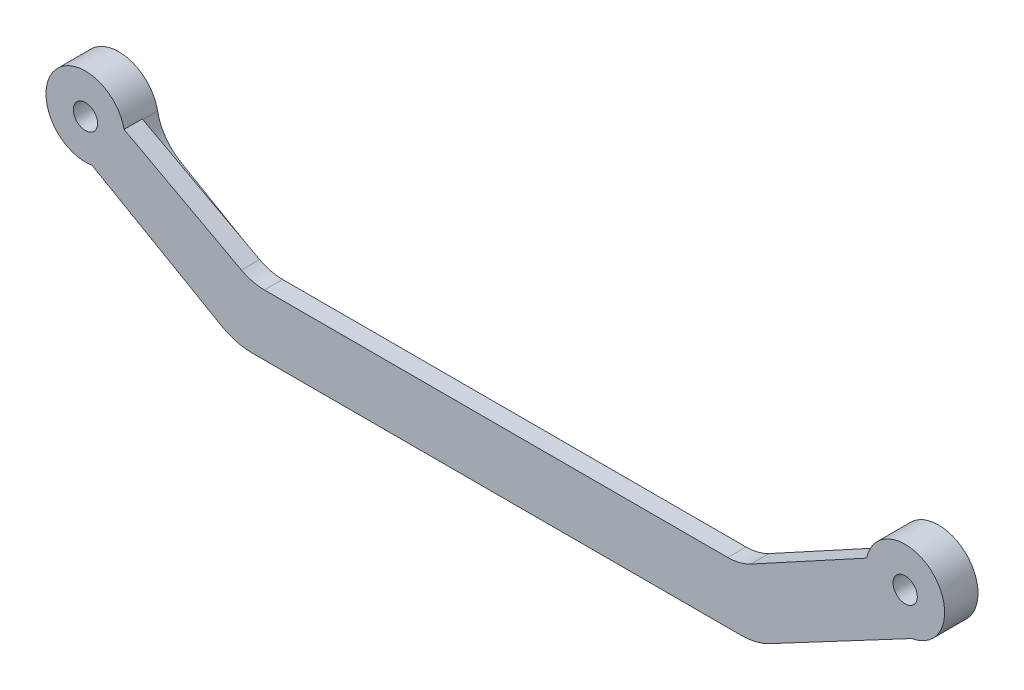
ISO-10303-21;
HEADER;
FILE_DESCRIPTION(('STEP AP214'),'2;1');
FILE_NAME('part.step','',(''),(''),'','','');
FILE_SCHEMA(('AUTOMOTIVE_DESIGN { 1 0 10303 214 1 1 1 1 }'));
ENDSEC;
DATA;
#1=APPLICATION_CONTEXT('core data for automotive mechanical design processes');
#2=APPLICATION_PROTOCOL_DEFINITION('international standard','automotive_design',2000,#1);
#3=PRODUCT_CONTEXT('',#1,'mechanical');
#4=PRODUCT('Part','Part','',(#3));
#5=PRODUCT_RELATED_PRODUCT_CATEGORY('part','',(#4));
#6=PRODUCT_DEFINITION_FORMATION('','',#4);
#7=PRODUCT_DEFINITION_CONTEXT('part definition',#1,'design');
#8=PRODUCT_DEFINITION('design','',#6,#7);
#9=PRODUCT_DEFINITION_SHAPE('','',#8);
#10=(LENGTH_UNIT() NAMED_UNIT(*) SI_UNIT(.MILLI.,.METRE.));
#11=(NAMED_UNIT(*) PLANE_ANGLE_UNIT() SI_UNIT($,.RADIAN.));
#12=(NAMED_UNIT(*) SI_UNIT($,.STERADIAN.) SOLID_ANGLE_UNIT());
#13=UNCERTAINTY_MEASURE_WITH_UNIT(LENGTH_MEASURE(1.E-05),#10,'distance_accuracy_value','');
#14=(GEOMETRIC_REPRESENTATION_CONTEXT(3) GLOBAL_UNCERTAINTY_ASSIGNED_CONTEXT((#13)) GLOBAL_UNIT_ASSIGNED_CONTEXT((#10,
#11,#12)) REPRESENTATION_CONTEXT('',''));
#15=CARTESIAN_POINT('',(0.,0.,0.));
#16=DIRECTION('',(0.,0.,1.));
#17=DIRECTION('',(1.,0.,0.));
#18=AXIS2_PLACEMENT_3D('',#15,#16,#17);
#19=CARTESIAN_POINT('',(-41.12,-13.8583741431154,8.));
#20=DIRECTION('',(-0.500348796428705,-0.865823932397544,0.));
#21=DIRECTION('',(0.865823932397544,-0.500348796428705,0.));
#22=AXIS2_PLACEMENT_3D('',#19,#20,#21);
#23=PLANE('',#22);
#24=DIRECTION('',(-0.865823932397544,0.500348796428705,0.));
#25=VECTOR('',#24,1.);
#26=CARTESIAN_POINT('',(-41.12,-13.8583741431154,8.));
#27=LINE('',#26,#25);
#28=CARTESIAN_POINT('',(-42.9774698500629,-12.7849656022957,8.));
#29=VERTEX_POINT('',#28);
#30=CARTESIAN_POINT('',(-57.2678634588736,-4.5267262823668,8.));
#31=VERTEX_POINT('',#30);
#32=EDGE_CURVE('E255',#29,#31,#27,.T.);
#33=ORIENTED_EDGE('',*,*,#32,.F.);
#34=DIRECTION('',(0.,0.,-1.));
#35=VECTOR('',#34,1.);
#36=CARTESIAN_POINT('',(-42.9774698500629,-12.7849656022958,5.5));
#37=LINE('',#36,#35);
#38=CARTESIAN_POINT('',(-42.9774698500629,-12.7849656022957,5.5));
#39=VERTEX_POINT('',#38);
#40=EDGE_CURVE('E397',#29,#39,#37,.T.);
#41=ORIENTED_EDGE('',*,*,#40,.T.);
#42=DIRECTION('',(-0.865823932397544,0.500348796428705,0.));
#43=VECTOR('',#42,1.);
#44=CARTESIAN_POINT('',(-41.12,-13.8583741431154,5.5));
#45=LINE('',#44,#43);
#46=CARTESIAN_POINT('',(-57.2678634588736,-4.5267262823668,5.5));
#47=VERTEX_POINT('',#46);
#48=EDGE_CURVE('E245',#39,#47,#45,.T.);
#49=ORIENTED_EDGE('',*,*,#48,.T.);
#50=DIRECTION('',(0.,0.,1.));
#51=VECTOR('',#50,1.);
#52=CARTESIAN_POINT('',(-57.2678634588736,-4.5267262823668,8.));
#53=LINE('',#52,#51);
#54=EDGE_CURVE('E346',#47,#31,#53,.T.);
#55=ORIENTED_EDGE('',*,*,#54,.T.);
#56=EDGE_LOOP('',(#33,#41,#49,#55));
#57=FACE_BOUND('',#56,.T.);
#58=ADVANCED_FACE('F35',(#57),#23,.F.);
#59=CARTESIAN_POINT('',(-67.5,-0.359999999999997,8.));
#60=DIRECTION('',(0.,0.,-1.));
#61=DIRECTION('',(-1.,0.,0.));
#62=AXIS2_PLACEMENT_3D('',#59,#60,#61);
#63=CYLINDRICAL_SURFACE('',#62,6.5);
#64=CARTESIAN_POINT('',(-67.5,-0.359999999999997,8.));
#65=DIRECTION('',(0.,0.,1.));
#66=DIRECTION('',(1.,0.,0.));
#67=AXIS2_PLACEMENT_3D('',#64,#65,#66);
#68=CIRCLE('',#67,6.5);
#69=CARTESIAN_POINT('',(-61.1188258667852,0.877180941330215,8.));
#70=VERTEX_POINT('',#69);
#71=CARTESIAN_POINT('',(-61.14,0.981789849417545,8.));
#72=VERTEX_POINT('',#71);
#73=EDGE_CURVE('E258',#70,#72,#68,.T.);
#74=ORIENTED_EDGE('',*,*,#73,.F.);
#75=DIRECTION('',(0.,0.,-1.));
#76=VECTOR('',#75,1.);
#77=CARTESIAN_POINT('',(-61.1188258667852,0.877180941330215,8.));
#78=LINE('',#77,#76);
#79=CARTESIAN_POINT('',(-61.1188258667852,0.877180941330215,5.5));
#80=VERTEX_POINT('',#79);
#81=EDGE_CURVE('E343',#70,#80,#78,.T.);
#82=ORIENTED_EDGE('',*,*,#81,.T.);
#83=CARTESIAN_POINT('',(-67.5,-0.359999999999997,5.5));
#84=DIRECTION('',(0.,0.,1.));
#85=DIRECTION('',(1.,0.,0.));
#86=AXIS2_PLACEMENT_3D('',#83,#84,#85);
#87=CIRCLE('',#86,6.5);
#88=CARTESIAN_POINT('',(-65.3745958226368,-6.50269135500448,5.5));
#89=VERTEX_POINT('',#88);
#90=EDGE_CURVE('E248',#80,#89,#87,.T.);
#91=ORIENTED_EDGE('',*,*,#90,.T.);
#92=DIRECTION('',(0.,0.,-1.));
#93=VECTOR('',#92,1.);
#94=CARTESIAN_POINT('',(-65.3745958226368,-6.50269135500448,8.));
#95=LINE('',#94,#93);
#96=CARTESIAN_POINT('',(-65.3745958226368,-6.50269135500448,8.));
#97=VERTEX_POINT('',#96);
#98=EDGE_CURVE('E341',#89,#97,#95,.F.);
#99=ORIENTED_EDGE('',*,*,#98,.T.);
#100=CARTESIAN_POINT('',(-66.4124611078909,-6.7683741431154,8.));
#101=VERTEX_POINT('',#100);
#102=EDGE_CURVE('E243',#101,#97,#68,.T.);
#103=ORIENTED_EDGE('',*,*,#102,.F.);
#104=DIRECTION('',(0.,0.,-1.));
#105=VECTOR('',#104,1.);
#106=CARTESIAN_POINT('',(-66.4124611078909,-6.7683741431154,11.));
#107=LINE('',#106,#105);
#108=CARTESIAN_POINT('',(-66.4124611078909,-6.7683741431154,11.));
#109=VERTEX_POINT('',#108);
#110=EDGE_CURVE('E225',#109,#101,#107,.T.);
#111=ORIENTED_EDGE('',*,*,#110,.F.);
#112=CARTESIAN_POINT('',(-67.5,-0.359999999999997,11.));
#113=DIRECTION('',(0.,0.,1.));
#114=DIRECTION('',(1.,0.,0.));
#115=AXIS2_PLACEMENT_3D('',#112,#113,#114);
#116=CIRCLE('',#115,6.5);
#117=CARTESIAN_POINT('',(-61.14,0.981789849417544,11.));
#118=VERTEX_POINT('',#117);
#119=EDGE_CURVE('E230',#118,#109,#116,.T.);
#120=ORIENTED_EDGE('',*,*,#119,.F.);
#121=DIRECTION('',(0.,0.,-1.));
#122=VECTOR('',#121,1.);
#123=CARTESIAN_POINT('',(-61.14,0.981789849417544,11.));
#124=LINE('',#123,#122);
#125=EDGE_CURVE('E425',#118,#72,#124,.T.);
#126=ORIENTED_EDGE('',*,*,#125,.T.);
#127=EDGE_LOOP('',(#74,#82,#91,#99,#103,#111,#120,#126));
#128=FACE_BOUND('',#127,.T.);
#129=ADVANCED_FACE('F241',(#128),#63,.T.);
#130=CARTESIAN_POINT('',(-41.92,-16.8583741431154,8.));
#131=DIRECTION('',(0.500069990121084,0.865984991198057,0.));
#132=DIRECTION('',(-0.865984991198057,0.500069990121084,0.));
#133=AXIS2_PLACEMENT_3D('',#130,#131,#132);
#134=PLANE('',#133);
#135=DIRECTION('',(0.865984991198057,-0.500069990121084,0.));
#136=VECTOR('',#135,1.);
#137=CARTESIAN_POINT('',(-41.92,-16.8583741431154,8.));
#138=LINE('',#137,#136);
#139=CARTESIAN_POINT('',(-58.758153837221,-7.13504693927171,8.));
#140=VERTEX_POINT('',#139);
#141=CARTESIAN_POINT('',(-44.240774861728,-15.518224055096,8.));
#142=VERTEX_POINT('',#141);
#143=EDGE_CURVE('E261',#140,#142,#138,.T.);
#144=ORIENTED_EDGE('',*,*,#143,.F.);
#145=DIRECTION('',(0.,0.,1.));
#146=VECTOR('',#145,1.);
#147=CARTESIAN_POINT('',(-58.758153837221,-7.13504693927171,5.5));
#148=LINE('',#147,#146);
#149=CARTESIAN_POINT('',(-58.758153837221,-7.13504693927171,5.5));
#150=VERTEX_POINT('',#149);
#151=EDGE_CURVE('E353',#140,#150,#148,.F.);
#152=ORIENTED_EDGE('',*,*,#151,.T.);
#153=DIRECTION('',(0.865984991198057,-0.500069990121084,0.));
#154=VECTOR('',#153,1.);
#155=CARTESIAN_POINT('',(-41.92,-16.8583741431154,5.5));
#156=LINE('',#155,#154);
#157=CARTESIAN_POINT('',(-44.240774861728,-15.518224055096,5.5));
#158=VERTEX_POINT('',#157);
#159=EDGE_CURVE('E281',#150,#158,#156,.T.);
#160=ORIENTED_EDGE('',*,*,#159,.T.);
#161=DIRECTION('',(0.,0.,-1.));
#162=VECTOR('',#161,1.);
#163=CARTESIAN_POINT('',(-44.240774861728,-15.518224055096,8.));
#164=LINE('',#163,#162);
#165=EDGE_CURVE('E328',#158,#142,#164,.F.);
#166=ORIENTED_EDGE('',*,*,#165,.T.);
#167=EDGE_LOOP('',(#144,#152,#160,#166));
#168=FACE_BOUND('',#167,.T.);
#169=ADVANCED_FACE('F494',(#168),#134,.F.);
#170=CARTESIAN_POINT('',(-41.92,-16.8583741431154,8.));
#171=DIRECTION('',(0.,1.,0.));
#172=DIRECTION('',(0.,0.,1.));
#173=AXIS2_PLACEMENT_3D('',#170,#171,#172);
#174=PLANE('',#173);
#175=DIRECTION('',(1.,0.,0.));
#176=VECTOR('',#175,1.);
#177=CARTESIAN_POINT('',(-41.92,-16.8583741431154,8.));
#178=LINE('',#177,#176);
#179=CARTESIAN_POINT('',(-39.2400749605172,-16.8583741431154,8.));
#180=VERTEX_POINT('',#179);
#181=CARTESIAN_POINT('',(39.2394856357598,-16.8583741431154,8.));
#182=VERTEX_POINT('',#181);
#183=EDGE_CURVE('E263',#180,#182,#178,.T.);
#184=ORIENTED_EDGE('',*,*,#183,.F.);
#185=DIRECTION('',(0.,0.,-1.));
#186=VECTOR('',#185,1.);
#187=CARTESIAN_POINT('',(-39.2400749605172,-16.8583741431154,8.));
#188=LINE('',#187,#186);
#189=CARTESIAN_POINT('',(-39.2400749605172,-16.8583741431154,5.5));
#190=VERTEX_POINT('',#189);
#191=EDGE_CURVE('E320',#180,#190,#188,.T.);
#192=ORIENTED_EDGE('',*,*,#191,.T.);
#193=DIRECTION('',(1.,0.,0.));
#194=VECTOR('',#193,1.);
#195=CARTESIAN_POINT('',(-41.92,-16.8583741431154,5.5));
#196=LINE('',#195,#194);
#197=CARTESIAN_POINT('',(39.2394856357598,-16.8583741431154,5.5));
#198=VERTEX_POINT('',#197);
#199=EDGE_CURVE('E283',#190,#198,#196,.T.);
#200=ORIENTED_EDGE('',*,*,#199,.T.);
#201=DIRECTION('',(0.,0.,-1.));
#202=VECTOR('',#201,1.);
#203=CARTESIAN_POINT('',(39.2394856357598,-16.8583741431154,8.));
#204=LINE('',#203,#202);
#205=EDGE_CURVE('E318',#198,#182,#204,.F.);
#206=ORIENTED_EDGE('',*,*,#205,.T.);
#207=EDGE_LOOP('',(#184,#192,#200,#206));
#208=FACE_BOUND('',#207,.T.);
#209=ADVANCED_FACE('F583',(#208),#174,.F.);
#210=CARTESIAN_POINT('',(41.92,-16.8583741431154,8.));
#211=DIRECTION('',(-0.500165215565365,0.865929995518374,0.));
#212=DIRECTION('',(-0.865929995518374,-0.500165215565365,0.));
#213=AXIS2_PLACEMENT_3D('',#210,#211,#212);
#214=PLANE('',#213);
#215=DIRECTION('',(0.865929995518374,0.500165215565365,0.));
#216=VECTOR('',#215,1.);
#217=CARTESIAN_POINT('',(41.92,-16.8583741431154,5.5));
#218=LINE('',#217,#216);
#219=CARTESIAN_POINT('',(44.2411377914135,-15.5176740982991,5.5));
#220=VERTEX_POINT('',#219);
#221=CARTESIAN_POINT('',(58.7527356341191,-7.13570731026823,5.5));
#222=VERTEX_POINT('',#221);
#223=EDGE_CURVE('E286',#220,#222,#218,.T.);
#224=ORIENTED_EDGE('',*,*,#223,.T.);
#225=DIRECTION('',(0.,0.,1.));
#226=VECTOR('',#225,1.);
#227=CARTESIAN_POINT('',(58.7527356341191,-7.13570731026823,8.));
#228=LINE('',#227,#226);
#229=CARTESIAN_POINT('',(58.7527356341191,-7.13570731026823,8.));
#230=VERTEX_POINT('',#229);
#231=EDGE_CURVE('E365',#222,#230,#228,.T.);
#232=ORIENTED_EDGE('',*,*,#231,.T.);
#233=DIRECTION('',(0.865929995518374,0.500165215565365,0.));
#234=VECTOR('',#233,1.);
#235=CARTESIAN_POINT('',(41.92,-16.8583741431154,8.));
#236=LINE('',#235,#234);
#237=CARTESIAN_POINT('',(44.2411377914135,-15.5176740982991,8.));
#238=VERTEX_POINT('',#237);
#239=EDGE_CURVE('E266',#238,#230,#236,.T.);
#240=ORIENTED_EDGE('',*,*,#239,.F.);
#241=DIRECTION('',(0.,0.,-1.));
#242=VECTOR('',#241,1.);
#243=CARTESIAN_POINT('',(44.2411377914135,-15.5176740982991,8.));
#244=LINE('',#243,#242);
#245=EDGE_CURVE('E334',#238,#220,#244,.T.);
#246=ORIENTED_EDGE('',*,*,#245,.T.);
#247=EDGE_LOOP('',(#224,#232,#240,#246));
#248=FACE_BOUND('',#247,.T.);
#249=ADVANCED_FACE('F574',(#248),#214,.F.);
#250=CARTESIAN_POINT('',(67.4947065521267,-0.359999999999998,8.));
#251=DIRECTION('',(0.,0.,-1.));
#252=DIRECTION('',(-1.,0.,0.));
#253=AXIS2_PLACEMENT_3D('',#250,#251,#252);
#254=CYLINDRICAL_SURFACE('',#253,6.5);
#255=CARTESIAN_POINT('',(67.4947065521267,-0.359999999999998,8.));
#256=DIRECTION('',(0.,0.,1.));
#257=DIRECTION('',(1.,0.,0.));
#258=AXIS2_PLACEMENT_3D('',#255,#256,#257);
#259=CIRCLE('',#258,6.5);
#260=CARTESIAN_POINT('',(65.3695879481508,-6.50279015749648,8.));
#261=VERTEX_POINT('',#260);
#262=CARTESIAN_POINT('',(68.5822454442358,-6.76837414311541,8.));
#263=VERTEX_POINT('',#262);
#264=EDGE_CURVE('E270',#261,#263,#259,.T.);
#265=ORIENTED_EDGE('',*,*,#264,.F.);
#266=DIRECTION('',(0.,0.,-1.));
#267=VECTOR('',#266,1.);
#268=CARTESIAN_POINT('',(65.3695879481508,-6.50279015749648,8.));
#269=LINE('',#268,#267);
#270=CARTESIAN_POINT('',(65.3695879481508,-6.50279015749648,5.5));
#271=VERTEX_POINT('',#270);
#272=EDGE_CURVE('E362',#261,#271,#269,.T.);
#273=ORIENTED_EDGE('',*,*,#272,.T.);
#274=CARTESIAN_POINT('',(67.4947065521267,-0.359999999999998,5.5));
#275=DIRECTION('',(0.,0.,1.));
#276=DIRECTION('',(1.,0.,0.));
#277=AXIS2_PLACEMENT_3D('',#274,#275,#276);
#278=CIRCLE('',#277,6.5);
#279=CARTESIAN_POINT('',(61.111852857341,0.868486349521562,5.5));
#280=VERTEX_POINT('',#279);
#281=EDGE_CURVE('E289',#271,#280,#278,.T.);
#282=ORIENTED_EDGE('',*,*,#281,.T.);
#283=DIRECTION('',(0.,0.,-1.));
#284=VECTOR('',#283,1.);
#285=CARTESIAN_POINT('',(61.111852857341,0.868486349521562,8.));
#286=LINE('',#285,#284);
#287=CARTESIAN_POINT('',(61.111852857341,0.868486349521562,8.));
#288=VERTEX_POINT('',#287);
#289=EDGE_CURVE('E360',#280,#288,#286,.F.);
#290=ORIENTED_EDGE('',*,*,#289,.T.);
#291=CARTESIAN_POINT('',(61.1347065521267,0.981789849417545,8.));
#292=VERTEX_POINT('',#291);
#293=EDGE_CURVE('E269',#292,#288,#259,.T.);
#294=ORIENTED_EDGE('',*,*,#293,.F.);
#295=DIRECTION('',(0.,0.,-1.));
#296=VECTOR('',#295,1.);
#297=CARTESIAN_POINT('',(61.1347065521267,0.981789849417544,11.));
#298=LINE('',#297,#296);
#299=CARTESIAN_POINT('',(61.1347065521267,0.981789849417544,11.));
#300=VERTEX_POINT('',#299);
#301=EDGE_CURVE('E251',#300,#292,#298,.T.);
#302=ORIENTED_EDGE('',*,*,#301,.F.);
#303=CARTESIAN_POINT('',(67.4947065521267,-0.359999999999998,11.));
#304=DIRECTION('',(0.,0.,1.));
#305=DIRECTION('',(1.,0.,0.));
#306=AXIS2_PLACEMENT_3D('',#303,#304,#305);
#307=CIRCLE('',#306,6.5);
#308=CARTESIAN_POINT('',(68.5822454442358,-6.76837414311541,11.));
#309=VERTEX_POINT('',#308);
#310=EDGE_CURVE('E457',#309,#300,#307,.T.);
#311=ORIENTED_EDGE('',*,*,#310,.F.);
#312=DIRECTION('',(0.,0.,-1.));
#313=VECTOR('',#312,1.);
#314=CARTESIAN_POINT('',(68.5822454442358,-6.76837414311541,11.));
#315=LINE('',#314,#313);
#316=EDGE_CURVE('E246',#309,#263,#315,.T.);
#317=ORIENTED_EDGE('',*,*,#316,.T.);
#318=EDGE_LOOP('',(#265,#273,#282,#290,#294,#302,#311,#317));
#319=FACE_BOUND('',#318,.T.);
#320=ADVANCED_FACE('F570',(#319),#254,.T.);
#321=CARTESIAN_POINT('',(41.12,-13.8583741431154,8.));
#322=DIRECTION('',(0.499778448583852,-0.866153278774097,0.));
#323=DIRECTION('',(0.866153278774097,0.499778448583852,0.));
#324=AXIS2_PLACEMENT_3D('',#321,#322,#323);
#325=PLANE('',#324);
#326=DIRECTION('',(-0.866153278774097,-0.499778448583852,0.));
#327=VECTOR('',#326,1.);
#328=CARTESIAN_POINT('',(41.12,-13.8583741431154,5.5));
#329=LINE('',#328,#327);
#330=CARTESIAN_POINT('',(57.2542605139679,-4.54875668126006,5.5));
#331=VERTEX_POINT('',#330);
#332=CARTESIAN_POINT('',(42.975730702618,-12.7876003733082,5.5));
#333=VERTEX_POINT('',#332);
#334=EDGE_CURVE('E292',#331,#333,#329,.T.);
#335=ORIENTED_EDGE('',*,*,#334,.T.);
#336=DIRECTION('',(0.,0.,-1.));
#337=VECTOR('',#336,1.);
#338=CARTESIAN_POINT('',(42.975730702618,-12.7876003733082,8.));
#339=LINE('',#338,#337);
#340=CARTESIAN_POINT('',(42.975730702618,-12.7876003733082,8.));
#341=VERTEX_POINT('',#340);
#342=EDGE_CURVE('E391',#333,#341,#339,.F.);
#343=ORIENTED_EDGE('',*,*,#342,.T.);
#344=DIRECTION('',(-0.866153278774097,-0.499778448583852,0.));
#345=VECTOR('',#344,1.);
#346=CARTESIAN_POINT('',(41.12,-13.8583741431154,8.));
#347=LINE('',#346,#345);
#348=CARTESIAN_POINT('',(57.2542605139679,-4.54875668126006,8.));
#349=VERTEX_POINT('',#348);
#350=EDGE_CURVE('E272',#349,#341,#347,.T.);
#351=ORIENTED_EDGE('',*,*,#350,.F.);
#352=DIRECTION('',(0.,0.,1.));
#353=VECTOR('',#352,1.);
#354=CARTESIAN_POINT('',(57.2542605139679,-4.54875668126006,5.5));
#355=LINE('',#354,#353);
#356=EDGE_CURVE('E367',#349,#331,#355,.F.);
#357=ORIENTED_EDGE('',*,*,#356,.T.);
#358=EDGE_LOOP('',(#335,#343,#351,#357));
#359=FACE_BOUND('',#358,.T.);
#360=ADVANCED_FACE('F573',(#359),#325,.F.);
#361=CARTESIAN_POINT('',(-41.12,-13.8583741431154,8.));
#362=DIRECTION('',(0.,-1.,0.));
#363=DIRECTION('',(1.,0.,0.));
#364=AXIS2_PLACEMENT_3D('',#361,#362,#363);
#365=PLANE('',#364);
#366=DIRECTION('',(-1.,0.,0.));
#367=VECTOR('',#366,1.);
#368=CARTESIAN_POINT('',(-41.12,-13.8583741431154,8.));
#369=LINE('',#368,#367);
#370=CARTESIAN_POINT('',(38.9775031139471,-13.8583741431154,8.));
#371=VERTEX_POINT('',#370);
#372=CARTESIAN_POINT('',(-38.9746794786333,-13.8583741431154,8.));
#373=VERTEX_POINT('',#372);
#374=EDGE_CURVE('E275',#371,#373,#369,.T.);
#375=ORIENTED_EDGE('',*,*,#374,.F.);
#376=DIRECTION('',(0.,0.,-1.));
#377=VECTOR('',#376,1.);
#378=CARTESIAN_POINT('',(38.9775031139471,-13.8583741431154,5.5));
#379=LINE('',#378,#377);
#380=CARTESIAN_POINT('',(38.9775031139471,-13.8583741431154,5.5));
#381=VERTEX_POINT('',#380);
#382=EDGE_CURVE('E388',#371,#381,#379,.T.);
#383=ORIENTED_EDGE('',*,*,#382,.T.);
#384=DIRECTION('',(-1.,0.,0.));
#385=VECTOR('',#384,1.);
#386=CARTESIAN_POINT('',(-41.12,-13.8583741431154,5.5));
#387=LINE('',#386,#385);
#388=CARTESIAN_POINT('',(-38.9746794786333,-13.8583741431154,5.5));
#389=VERTEX_POINT('',#388);
#390=EDGE_CURVE('E257',#381,#389,#387,.T.);
#391=ORIENTED_EDGE('',*,*,#390,.T.);
#392=DIRECTION('',(0.,0.,-1.));
#393=VECTOR('',#392,1.);
#394=CARTESIAN_POINT('',(-38.9746794786333,-13.8583741431154,8.));
#395=LINE('',#394,#393);
#396=EDGE_CURVE('E386',#389,#373,#395,.F.);
#397=ORIENTED_EDGE('',*,*,#396,.T.);
#398=EDGE_LOOP('',(#375,#383,#391,#397));
#399=FACE_BOUND('',#398,.T.);
#400=ADVANCED_FACE('F580',(#399),#365,.F.);
#401=CARTESIAN_POINT('',(-67.5,-0.359999999999997,5.5));
#402=DIRECTION('',(0.,0.,1.));
#403=DIRECTION('',(1.,0.,0.));
#404=AXIS2_PLACEMENT_3D('',#401,#402,#403);
#405=PLANE('',#404);
#406=CARTESIAN_POINT('',(67.4947065521267,-0.359999999999998,5.5));
#407=DIRECTION('',(0.,0.,1.));
#408=DIRECTION('',(1.,0.,0.));
#409=AXIS2_PLACEMENT_3D('',#406,#407,#408);
#410=CIRCLE('',#409,2.);
#411=CARTESIAN_POINT('',(69.4947065521267,-0.359999999999998,5.5));
#412=VERTEX_POINT('',#411);
#413=EDGE_CURVE('E301',#412,#412,#410,.T.);
#414=ORIENTED_EDGE('',*,*,#413,.T.);
#415=EDGE_LOOP('',(#414));
#416=FACE_BOUND('',#415,.T.);
#417=CARTESIAN_POINT('',(-67.5,-0.359999999999997,5.5));
#418=DIRECTION('',(0.,0.,1.));
#419=DIRECTION('',(1.,0.,0.));
#420=AXIS2_PLACEMENT_3D('',#417,#418,#419);
#421=CIRCLE('',#420,2.);
#422=CARTESIAN_POINT('',(-65.5,-0.359999999999997,5.5));
#423=VERTEX_POINT('',#422);
#424=EDGE_CURVE('E464',#423,#423,#421,.T.);
#425=ORIENTED_EDGE('',*,*,#424,.T.);
#426=EDGE_LOOP('',(#425));
#427=FACE_BOUND('',#426,.T.);
#428=ORIENTED_EDGE('',*,*,#199,.F.);
#429=CARTESIAN_POINT('',(-39.2400749605172,-6.8583741431154,5.5));
#430=DIRECTION('',(0.,0.,1.));
#431=DIRECTION('',(1.,0.,0.));
#432=AXIS2_PLACEMENT_3D('',#429,#430,#431);
#433=CIRCLE('',#432,10.);
#434=EDGE_CURVE('E325',#190,#158,#433,.F.);
#435=ORIENTED_EDGE('',*,*,#434,.T.);
#436=ORIENTED_EDGE('',*,*,#159,.F.);
#437=CARTESIAN_POINT('',(-62.7587137581897,-14.0629268688562,5.5));
#438=DIRECTION('',(0.,0.,1.));
#439=DIRECTION('',(1.,0.,0.));
#440=AXIS2_PLACEMENT_3D('',#437,#438,#439);
#441=CIRCLE('',#440,8.);
#442=EDGE_CURVE('E373',#150,#89,#441,.T.);
#443=ORIENTED_EDGE('',*,*,#442,.T.);
#444=ORIENTED_EDGE('',*,*,#90,.F.);
#445=CARTESIAN_POINT('',(-53.265073087444,2.39986517681355,5.5));
#446=DIRECTION('',(0.,0.,1.));
#447=DIRECTION('',(1.,0.,0.));
#448=AXIS2_PLACEMENT_3D('',#445,#446,#447);
#449=CIRCLE('',#448,8.);
#450=EDGE_CURVE('E370',#80,#47,#449,.T.);
#451=ORIENTED_EDGE('',*,*,#450,.T.);
#452=ORIENTED_EDGE('',*,*,#48,.F.);
#453=CARTESIAN_POINT('',(-38.9746794786333,-5.8583741431154,5.5));
#454=DIRECTION('',(0.,0.,1.));
#455=DIRECTION('',(1.,0.,0.));
#456=AXIS2_PLACEMENT_3D('',#453,#454,#455);
#457=CIRCLE('',#456,8.);
#458=EDGE_CURVE('E56',#39,#389,#457,.T.);
#459=ORIENTED_EDGE('',*,*,#458,.T.);
#460=ORIENTED_EDGE('',*,*,#390,.F.);
#461=CARTESIAN_POINT('',(38.9775031139471,-5.8583741431154,5.5));
#462=DIRECTION('',(0.,0.,1.));
#463=DIRECTION('',(1.,0.,0.));
#464=AXIS2_PLACEMENT_3D('',#461,#462,#463);
#465=CIRCLE('',#464,8.);
#466=EDGE_CURVE('E406',#381,#333,#465,.T.);
#467=ORIENTED_EDGE('',*,*,#466,.T.);
#468=ORIENTED_EDGE('',*,*,#334,.F.);
#469=CARTESIAN_POINT('',(53.2560329252971,2.38046954893271,5.5));
#470=DIRECTION('',(0.,0.,1.));
#471=DIRECTION('',(1.,0.,0.));
#472=AXIS2_PLACEMENT_3D('',#469,#470,#471);
#473=CIRCLE('',#472,8.);
#474=EDGE_CURVE('E377',#331,#280,#473,.T.);
#475=ORIENTED_EDGE('',*,*,#474,.T.);
#476=ORIENTED_EDGE('',*,*,#281,.F.);
#477=CARTESIAN_POINT('',(62.7540573586421,-14.0631472744152,5.5));
#478=DIRECTION('',(0.,0.,1.));
#479=DIRECTION('',(1.,0.,0.));
#480=AXIS2_PLACEMENT_3D('',#477,#478,#479);
#481=CIRCLE('',#480,8.);
#482=EDGE_CURVE('E375',#271,#222,#481,.T.);
#483=ORIENTED_EDGE('',*,*,#482,.T.);
#484=ORIENTED_EDGE('',*,*,#223,.F.);
#485=CARTESIAN_POINT('',(39.2394856357598,-6.8583741431154,5.5));
#486=DIRECTION('',(0.,0.,1.));
#487=DIRECTION('',(1.,0.,0.));
#488=AXIS2_PLACEMENT_3D('',#485,#486,#487);
#489=CIRCLE('',#488,10.);
#490=EDGE_CURVE('E323',#220,#198,#489,.F.);
#491=ORIENTED_EDGE('',*,*,#490,.T.);
#492=EDGE_LOOP('',(#428,#435,#436,#443,#444,#451,#452,#459,#460,#467,#468,#475,#476,#483,#484,#491));
#493=FACE_BOUND('',#492,.T.);
#494=ADVANCED_FACE('F470',(#416,#427,#493),#405,.F.);
#495=CARTESIAN_POINT('',(-67.5,-0.359999999999997,8.));
#496=DIRECTION('',(0.,0.,1.));
#497=DIRECTION('',(1.,0.,0.));
#498=AXIS2_PLACEMENT_3D('',#495,#496,#497);
#499=PLANE('',#498);
#500=ORIENTED_EDGE('',*,*,#102,.T.);
#501=CARTESIAN_POINT('',(-62.7587137581897,-14.0629268688562,8.));
#502=DIRECTION('',(0.,0.,1.));
#503=DIRECTION('',(1.,0.,0.));
#504=AXIS2_PLACEMENT_3D('',#501,#502,#503);
#505=CIRCLE('',#504,8.);
#506=EDGE_CURVE('E358',#97,#140,#505,.F.);
#507=ORIENTED_EDGE('',*,*,#506,.T.);
#508=ORIENTED_EDGE('',*,*,#143,.T.);
#509=CARTESIAN_POINT('',(-39.2400749605172,-6.8583741431154,8.));
#510=DIRECTION('',(0.,0.,1.));
#511=DIRECTION('',(1.,0.,0.));
#512=AXIS2_PLACEMENT_3D('',#509,#510,#511);
#513=CIRCLE('',#512,10.);
#514=EDGE_CURVE('E337',#142,#180,#513,.T.);
#515=ORIENTED_EDGE('',*,*,#514,.T.);
#516=ORIENTED_EDGE('',*,*,#183,.T.);
#517=CARTESIAN_POINT('',(39.2394856357598,-6.8583741431154,8.));
#518=DIRECTION('',(0.,0.,1.));
#519=DIRECTION('',(1.,0.,0.));
#520=AXIS2_PLACEMENT_3D('',#517,#518,#519);
#521=CIRCLE('',#520,10.);
#522=EDGE_CURVE('E339',#182,#238,#521,.T.);
#523=ORIENTED_EDGE('',*,*,#522,.T.);
#524=ORIENTED_EDGE('',*,*,#239,.T.);
#525=CARTESIAN_POINT('',(62.7540573586421,-14.0631472744152,8.));
#526=DIRECTION('',(0.,0.,1.));
#527=DIRECTION('',(1.,0.,0.));
#528=AXIS2_PLACEMENT_3D('',#525,#526,#527);
#529=CIRCLE('',#528,8.);
#530=EDGE_CURVE('E356',#230,#261,#529,.F.);
#531=ORIENTED_EDGE('',*,*,#530,.T.);
#532=ORIENTED_EDGE('',*,*,#264,.T.);
#533=DIRECTION('',(0.883199784952042,0.468996950801034,0.));
#534=VECTOR('',#533,1.);
#535=CARTESIAN_POINT('',(42.99,-20.3583741431154,8.));
#536=LINE('',#535,#534);
#537=CARTESIAN_POINT('',(45.1895436140153,-19.1903719926358,8.));
#538=VERTEX_POINT('',#537);
#539=EDGE_CURVE('E437',#538,#263,#536,.T.);
#540=ORIENTED_EDGE('',*,*,#539,.F.);
#541=CARTESIAN_POINT('',(40.499574106005,-10.3583741431154,8.));
#542=DIRECTION('',(0.,0.,1.));
#543=DIRECTION('',(1.,0.,0.));
#544=AXIS2_PLACEMENT_3D('',#541,#542,#543);
#545=CIRCLE('',#544,10.);
#546=CARTESIAN_POINT('',(40.499574106005,-20.3583741431154,8.));
#547=VERTEX_POINT('',#546);
#548=EDGE_CURVE('E309',#538,#547,#545,.F.);
#549=ORIENTED_EDGE('',*,*,#548,.T.);
#550=DIRECTION('',(1.,0.,0.));
#551=VECTOR('',#550,1.);
#552=CARTESIAN_POINT('',(-42.73,-20.3583741431154,8.));
#553=LINE('',#552,#551);
#554=CARTESIAN_POINT('',(-40.0646235317229,-20.3583741431154,8.));
#555=VERTEX_POINT('',#554);
#556=EDGE_CURVE('E434',#555,#547,#553,.T.);
#557=ORIENTED_EDGE('',*,*,#556,.F.);
#558=CARTESIAN_POINT('',(-40.0646235317229,-10.3583741431154,8.));
#559=DIRECTION('',(0.,0.,1.));
#560=DIRECTION('',(1.,0.,0.));
#561=AXIS2_PLACEMENT_3D('',#558,#559,#560);
#562=CIRCLE('',#561,10.);
#563=CARTESIAN_POINT('',(-45.041787226438,-19.0317726440497,8.));
#564=VERTEX_POINT('',#563);
#565=EDGE_CURVE('E311',#555,#564,#562,.F.);
#566=ORIENTED_EDGE('',*,*,#565,.T.);
#567=DIRECTION('',(0.867339850093432,-0.497716369471512,0.));
#568=VECTOR('',#567,1.);
#569=CARTESIAN_POINT('',(-66.4124611078909,-6.7683741431154,8.));
#570=LINE('',#569,#568);
#571=EDGE_CURVE('E304',#101,#564,#570,.T.);
#572=ORIENTED_EDGE('',*,*,#571,.F.);
#573=EDGE_LOOP('',(#500,#507,#508,#515,#516,#523,#524,#531,#532,#540,#549,#557,#566,#572));
#574=FACE_BOUND('',#573,.T.);
#575=ADVANCED_FACE('F554',(#574),#499,.F.);
#576=ORIENTED_EDGE('',*,*,#350,.T.);
#577=CARTESIAN_POINT('',(38.9775031139471,-5.8583741431154,8.));
#578=DIRECTION('',(0.,0.,1.));
#579=DIRECTION('',(1.,0.,0.));
#580=AXIS2_PLACEMENT_3D('',#577,#578,#579);
#581=CIRCLE('',#580,8.);
#582=EDGE_CURVE('E395',#341,#371,#581,.F.);
#583=ORIENTED_EDGE('',*,*,#582,.T.);
#584=ORIENTED_EDGE('',*,*,#374,.T.);
#585=CARTESIAN_POINT('',(-38.9746794786333,-5.8583741431154,8.));
#586=DIRECTION('',(0.,0.,1.));
#587=DIRECTION('',(1.,0.,0.));
#588=AXIS2_PLACEMENT_3D('',#585,#586,#587);
#589=CIRCLE('',#588,8.);
#590=EDGE_CURVE('E393',#373,#29,#589,.F.);
#591=ORIENTED_EDGE('',*,*,#590,.T.);
#592=ORIENTED_EDGE('',*,*,#32,.T.);
#593=CARTESIAN_POINT('',(-53.265073087444,2.39986517681355,8.));
#594=DIRECTION('',(0.,0.,1.));
#595=DIRECTION('',(1.,0.,0.));
#596=AXIS2_PLACEMENT_3D('',#593,#594,#595);
#597=CIRCLE('',#596,8.);
#598=EDGE_CURVE('E351',#31,#70,#597,.F.);
#599=ORIENTED_EDGE('',*,*,#598,.T.);
#600=ORIENTED_EDGE('',*,*,#73,.T.);
#601=DIRECTION('',(-0.880749691600735,0.473582073927224,0.));
#602=VECTOR('',#601,1.);
#603=CARTESIAN_POINT('',(-61.14,0.981789849417544,8.));
#604=LINE('',#603,#602);
#605=CARTESIAN_POINT('',(-41.8242170259947,-9.40437167592128,8.));
#606=VERTEX_POINT('',#605);
#607=EDGE_CURVE('E238',#606,#72,#604,.T.);
#608=ORIENTED_EDGE('',*,*,#607,.F.);
#609=CARTESIAN_POINT('',(-38.0355604345769,-2.3583741431154,8.));
#610=DIRECTION('',(0.,0.,1.));
#611=DIRECTION('',(1.,0.,0.));
#612=AXIS2_PLACEMENT_3D('',#609,#610,#611);
#613=CIRCLE('',#612,8.);
#614=CARTESIAN_POINT('',(-38.0355604345769,-10.3583741431154,8.));
#615=VERTEX_POINT('',#614);
#616=EDGE_CURVE('E43',#606,#615,#613,.T.);
#617=ORIENTED_EDGE('',*,*,#616,.T.);
#618=DIRECTION('',(-1.,0.,0.));
#619=VECTOR('',#618,1.);
#620=CARTESIAN_POINT('',(-40.05,-10.3583741431154,8.));
#621=LINE('',#620,#619);
#622=CARTESIAN_POINT('',(38.2730075524189,-10.3583741431154,8.));
#623=VERTEX_POINT('',#622);
#624=EDGE_CURVE('E413',#623,#615,#621,.T.);
#625=ORIENTED_EDGE('',*,*,#624,.F.);
#626=CARTESIAN_POINT('',(38.2730075524189,-2.3583741431154,8.));
#627=DIRECTION('',(0.,0.,1.));
#628=DIRECTION('',(1.,0.,0.));
#629=AXIS2_PLACEMENT_3D('',#626,#627,#628);
#630=CIRCLE('',#629,8.);
#631=CARTESIAN_POINT('',(42.0989439452957,-9.38419870096345,8.));
#632=VERTEX_POINT('',#631);
#633=EDGE_CURVE('E402',#623,#632,#630,.T.);
#634=ORIENTED_EDGE('',*,*,#633,.T.);
#635=DIRECTION('',(-0.878228069731006,-0.478242049109603,0.));
#636=VECTOR('',#635,1.);
#637=CARTESIAN_POINT('',(40.31,-10.3583741431154,8.));
#638=LINE('',#637,#636);
#639=EDGE_CURVE('E421',#292,#632,#638,.T.);
#640=ORIENTED_EDGE('',*,*,#639,.F.);
#641=ORIENTED_EDGE('',*,*,#293,.T.);
#642=CARTESIAN_POINT('',(53.2560329252971,2.38046954893271,8.));
#643=DIRECTION('',(0.,0.,1.));
#644=DIRECTION('',(1.,0.,0.));
#645=AXIS2_PLACEMENT_3D('',#642,#643,#644);
#646=CIRCLE('',#645,8.);
#647=EDGE_CURVE('E349',#288,#349,#646,.F.);
#648=ORIENTED_EDGE('',*,*,#647,.T.);
#649=EDGE_LOOP('',(#576,#583,#584,#591,#592,#599,#600,#608,#617,#625,#634,#640,#641,#648));
#650=FACE_BOUND('',#649,.T.);
#651=ADVANCED_FACE('F412',(#650),#499,.F.);
#652=CARTESIAN_POINT('',(-66.4124611078909,-6.7683741431154,11.));
#653=DIRECTION('',(0.497716369471512,0.867339850093432,0.));
#654=DIRECTION('',(-0.867339850093432,0.497716369471512,0.));
#655=AXIS2_PLACEMENT_3D('',#652,#653,#654);
#656=PLANE('',#655);
#657=ORIENTED_EDGE('',*,*,#571,.T.);
#658=DIRECTION('',(0.,0.,-1.));
#659=VECTOR('',#658,1.);
#660=CARTESIAN_POINT('',(-45.041787226438,-19.0317726440497,11.));
#661=LINE('',#660,#659);
#662=CARTESIAN_POINT('',(-45.041787226438,-19.0317726440497,11.));
#663=VERTEX_POINT('',#662);
#664=EDGE_CURVE('E227',#564,#663,#661,.F.);
#665=ORIENTED_EDGE('',*,*,#664,.T.);
#666=DIRECTION('',(0.867339850093432,-0.497716369471512,0.));
#667=VECTOR('',#666,1.);
#668=CARTESIAN_POINT('',(-66.4124611078909,-6.7683741431154,11.));
#669=LINE('',#668,#667);
#670=EDGE_CURVE('E220',#109,#663,#669,.T.);
#671=ORIENTED_EDGE('',*,*,#670,.F.);
#672=ORIENTED_EDGE('',*,*,#110,.T.);
#673=EDGE_LOOP('',(#657,#665,#671,#672));
#674=FACE_BOUND('',#673,.T.);
#675=ADVANCED_FACE('F223',(#674),#656,.F.);
#676=CARTESIAN_POINT('',(-42.73,-20.3583741431154,11.));
#677=DIRECTION('',(0.,1.,0.));
#678=DIRECTION('',(0.,0.,1.));
#679=AXIS2_PLACEMENT_3D('',#676,#677,#678);
#680=PLANE('',#679);
#681=DIRECTION('',(1.,0.,0.));
#682=VECTOR('',#681,1.);
#683=CARTESIAN_POINT('',(-42.73,-20.3583741431154,11.));
#684=LINE('',#683,#682);
#685=CARTESIAN_POINT('',(-40.0646235317229,-20.3583741431154,11.));
#686=VERTEX_POINT('',#685);
#687=CARTESIAN_POINT('',(40.499574106005,-20.3583741431154,11.));
#688=VERTEX_POINT('',#687);
#689=EDGE_CURVE('E229',#686,#688,#684,.T.);
#690=ORIENTED_EDGE('',*,*,#689,.F.);
#691=DIRECTION('',(0.,0.,-1.));
#692=VECTOR('',#691,1.);
#693=CARTESIAN_POINT('',(-40.0646235317229,-20.3583741431154,11.));
#694=LINE('',#693,#692);
#695=EDGE_CURVE('E306',#686,#555,#694,.T.);
#696=ORIENTED_EDGE('',*,*,#695,.T.);
#697=ORIENTED_EDGE('',*,*,#556,.T.);
#698=DIRECTION('',(0.,0.,-1.));
#699=VECTOR('',#698,1.);
#700=CARTESIAN_POINT('',(40.499574106005,-20.3583741431154,11.));
#701=LINE('',#700,#699);
#702=EDGE_CURVE('E277',#547,#688,#701,.F.);
#703=ORIENTED_EDGE('',*,*,#702,.T.);
#704=EDGE_LOOP('',(#690,#696,#697,#703));
#705=FACE_BOUND('',#704,.T.);
#706=ADVANCED_FACE('F561',(#705),#680,.F.);
#707=CARTESIAN_POINT('',(42.99,-20.3583741431154,11.));
#708=DIRECTION('',(-0.468996950801034,0.883199784952042,0.));
#709=DIRECTION('',(-0.883199784952042,-0.468996950801034,0.));
#710=AXIS2_PLACEMENT_3D('',#707,#708,#709);
#711=PLANE('',#710);
#712=DIRECTION('',(0.883199784952042,0.468996950801034,0.));
#713=VECTOR('',#712,1.);
#714=CARTESIAN_POINT('',(42.99,-20.3583741431154,11.));
#715=LINE('',#714,#713);
#716=CARTESIAN_POINT('',(45.1895436140153,-19.1903719926358,11.));
#717=VERTEX_POINT('',#716);
#718=EDGE_CURVE('E458',#717,#309,#715,.T.);
#719=ORIENTED_EDGE('',*,*,#718,.F.);
#720=DIRECTION('',(0.,0.,-1.));
#721=VECTOR('',#720,1.);
#722=CARTESIAN_POINT('',(45.1895436140153,-19.1903719926358,11.));
#723=LINE('',#722,#721);
#724=EDGE_CURVE('E331',#717,#538,#723,.T.);
#725=ORIENTED_EDGE('',*,*,#724,.T.);
#726=ORIENTED_EDGE('',*,*,#539,.T.);
#727=ORIENTED_EDGE('',*,*,#316,.F.);
#728=EDGE_LOOP('',(#719,#725,#726,#727));
#729=FACE_BOUND('',#728,.T.);
#730=ADVANCED_FACE('F567',(#729),#711,.F.);
#731=CARTESIAN_POINT('',(40.31,-10.3583741431154,11.));
#732=DIRECTION('',(0.478242049109603,-0.878228069731005,0.));
#733=DIRECTION('',(0.878228069731006,0.478242049109603,0.));
#734=AXIS2_PLACEMENT_3D('',#731,#732,#733);
#735=PLANE('',#734);
#736=ORIENTED_EDGE('',*,*,#639,.T.);
#737=DIRECTION('',(0.,0.,-1.));
#738=VECTOR('',#737,1.);
#739=CARTESIAN_POINT('',(42.0989439452957,-9.38419870096345,11.));
#740=LINE('',#739,#738);
#741=CARTESIAN_POINT('',(42.0989439452957,-9.38419870096345,11.));
#742=VERTEX_POINT('',#741);
#743=EDGE_CURVE('E384',#632,#742,#740,.F.);
#744=ORIENTED_EDGE('',*,*,#743,.T.);
#745=DIRECTION('',(-0.878228069731006,-0.478242049109603,0.));
#746=VECTOR('',#745,1.);
#747=CARTESIAN_POINT('',(40.31,-10.3583741431154,11.));
#748=LINE('',#747,#746);
#749=EDGE_CURVE('E429',#300,#742,#748,.T.);
#750=ORIENTED_EDGE('',*,*,#749,.F.);
#751=ORIENTED_EDGE('',*,*,#301,.T.);
#752=EDGE_LOOP('',(#736,#744,#750,#751));
#753=FACE_BOUND('',#752,.T.);
#754=ADVANCED_FACE('F447',(#753),#735,.F.);
#755=CARTESIAN_POINT('',(-40.05,-10.3583741431154,11.));
#756=DIRECTION('',(0.,-1.,0.));
#757=DIRECTION('',(0.,0.,-1.));
#758=AXIS2_PLACEMENT_3D('',#755,#756,#757);
#759=PLANE('',#758);
#760=DIRECTION('',(-1.,0.,0.));
#761=VECTOR('',#760,1.);
#762=CARTESIAN_POINT('',(-40.05,-10.3583741431154,11.));
#763=LINE('',#762,#761);
#764=CARTESIAN_POINT('',(38.2730075524189,-10.3583741431154,11.));
#765=VERTEX_POINT('',#764);
#766=CARTESIAN_POINT('',(-38.0355604345769,-10.3583741431154,11.));
#767=VERTEX_POINT('',#766);
#768=EDGE_CURVE('E426',#765,#767,#763,.T.);
#769=ORIENTED_EDGE('',*,*,#768,.F.);
#770=DIRECTION('',(0.,0.,-1.));
#771=VECTOR('',#770,1.);
#772=CARTESIAN_POINT('',(38.2730075524189,-10.3583741431154,8.));
#773=LINE('',#772,#771);
#774=EDGE_CURVE('E381',#765,#623,#773,.T.);
#775=ORIENTED_EDGE('',*,*,#774,.T.);
#776=ORIENTED_EDGE('',*,*,#624,.T.);
#777=DIRECTION('',(0.,0.,-1.));
#778=VECTOR('',#777,1.);
#779=CARTESIAN_POINT('',(-38.0355604345769,-10.3583741431154,11.));
#780=LINE('',#779,#778);
#781=EDGE_CURVE('E379',#615,#767,#780,.F.);
#782=ORIENTED_EDGE('',*,*,#781,.T.);
#783=EDGE_LOOP('',(#769,#775,#776,#782));
#784=FACE_BOUND('',#783,.T.);
#785=ADVANCED_FACE('F419',(#784),#759,.F.);
#786=CARTESIAN_POINT('',(-61.14,0.981789849417544,11.));
#787=DIRECTION('',(-0.473582073927224,-0.880749691600735,0.));
#788=DIRECTION('',(0.880749691600735,-0.473582073927224,0.));
#789=AXIS2_PLACEMENT_3D('',#786,#787,#788);
#790=PLANE('',#789);
#791=DIRECTION('',(-0.880749691600735,0.473582073927224,0.));
#792=VECTOR('',#791,1.);
#793=CARTESIAN_POINT('',(-61.14,0.981789849417544,11.));
#794=LINE('',#793,#792);
#795=CARTESIAN_POINT('',(-41.8242170259947,-9.40437167592128,11.));
#796=VERTEX_POINT('',#795);
#797=EDGE_CURVE('E234',#796,#118,#794,.T.);
#798=ORIENTED_EDGE('',*,*,#797,.F.);
#799=DIRECTION('',(0.,0.,-1.));
#800=VECTOR('',#799,1.);
#801=CARTESIAN_POINT('',(-41.8242170259947,-9.40437167592128,8.));
#802=LINE('',#801,#800);
#803=EDGE_CURVE('E399',#796,#606,#802,.T.);
#804=ORIENTED_EDGE('',*,*,#803,.T.);
#805=ORIENTED_EDGE('',*,*,#607,.T.);
#806=ORIENTED_EDGE('',*,*,#125,.F.);
#807=EDGE_LOOP('',(#798,#804,#805,#806));
#808=FACE_BOUND('',#807,.T.);
#809=ADVANCED_FACE('F424',(#808),#790,.F.);
#810=CARTESIAN_POINT('',(-67.5,-0.359999999999997,11.));
#811=DIRECTION('',(0.,0.,1.));
#812=DIRECTION('',(1.,0.,0.));
#813=AXIS2_PLACEMENT_3D('',#810,#811,#812);
#814=PLANE('',#813);
#815=CARTESIAN_POINT('',(67.4947065521267,-0.359999999999998,11.));
#816=DIRECTION('',(0.,0.,1.));
#817=DIRECTION('',(1.,0.,0.));
#818=AXIS2_PLACEMENT_3D('',#815,#816,#817);
#819=CIRCLE('',#818,2.);
#820=CARTESIAN_POINT('',(69.4947065521267,-0.359999999999998,11.));
#821=VERTEX_POINT('',#820);
#822=EDGE_CURVE('E300',#821,#821,#819,.T.);
#823=ORIENTED_EDGE('',*,*,#822,.F.);
#824=EDGE_LOOP('',(#823));
#825=FACE_BOUND('',#824,.T.);
#826=CARTESIAN_POINT('',(-67.5,-0.359999999999997,11.));
#827=DIRECTION('',(0.,0.,1.));
#828=DIRECTION('',(1.,0.,0.));
#829=AXIS2_PLACEMENT_3D('',#826,#827,#828);
#830=CIRCLE('',#829,2.);
#831=CARTESIAN_POINT('',(-65.5,-0.359999999999997,11.));
#832=VERTEX_POINT('',#831);
#833=EDGE_CURVE('E297',#832,#832,#830,.T.);
#834=ORIENTED_EDGE('',*,*,#833,.F.);
#835=EDGE_LOOP('',(#834));
#836=FACE_BOUND('',#835,.T.);
#837=ORIENTED_EDGE('',*,*,#670,.T.);
#838=CARTESIAN_POINT('',(-40.0646235317229,-10.3583741431154,11.));
#839=DIRECTION('',(0.,0.,1.));
#840=DIRECTION('',(1.,0.,0.));
#841=AXIS2_PLACEMENT_3D('',#838,#839,#840);
#842=CIRCLE('',#841,10.);
#843=EDGE_CURVE('E316',#663,#686,#842,.T.);
#844=ORIENTED_EDGE('',*,*,#843,.T.);
#845=ORIENTED_EDGE('',*,*,#689,.T.);
#846=CARTESIAN_POINT('',(40.499574106005,-10.3583741431154,11.));
#847=DIRECTION('',(0.,0.,1.));
#848=DIRECTION('',(1.,0.,0.));
#849=AXIS2_PLACEMENT_3D('',#846,#847,#848);
#850=CIRCLE('',#849,10.);
#851=EDGE_CURVE('E314',#688,#717,#850,.T.);
#852=ORIENTED_EDGE('',*,*,#851,.T.);
#853=ORIENTED_EDGE('',*,*,#718,.T.);
#854=ORIENTED_EDGE('',*,*,#310,.T.);
#855=ORIENTED_EDGE('',*,*,#749,.T.);
#856=CARTESIAN_POINT('',(38.2730075524189,-2.3583741431154,11.));
#857=DIRECTION('',(0.,0.,1.));
#858=DIRECTION('',(1.,0.,0.));
#859=AXIS2_PLACEMENT_3D('',#856,#857,#858);
#860=CIRCLE('',#859,8.);
#861=EDGE_CURVE('E404',#742,#765,#860,.F.);
#862=ORIENTED_EDGE('',*,*,#861,.T.);
#863=ORIENTED_EDGE('',*,*,#768,.T.);
#864=CARTESIAN_POINT('',(-38.0355604345769,-2.3583741431154,11.));
#865=DIRECTION('',(0.,0.,1.));
#866=DIRECTION('',(1.,0.,0.));
#867=AXIS2_PLACEMENT_3D('',#864,#865,#866);
#868=CIRCLE('',#867,8.);
#869=EDGE_CURVE('E11',#767,#796,#868,.F.);
#870=ORIENTED_EDGE('',*,*,#869,.T.);
#871=ORIENTED_EDGE('',*,*,#797,.T.);
#872=ORIENTED_EDGE('',*,*,#119,.T.);
#873=EDGE_LOOP('',(#837,#844,#845,#852,#853,#854,#855,#862,#863,#870,#871,#872));
#874=FACE_BOUND('',#873,.T.);
#875=ADVANCED_FACE('F233',(#825,#836,#874),#814,.T.);
#876=CARTESIAN_POINT('',(-67.5,-0.359999999999997,5.5));
#877=DIRECTION('',(0.,0.,1.));
#878=DIRECTION('',(1.,0.,0.));
#879=AXIS2_PLACEMENT_3D('',#876,#877,#878);
#880=CYLINDRICAL_SURFACE('',#879,2.);
#881=ORIENTED_EDGE('',*,*,#833,.T.);
#882=EDGE_LOOP('',(#881));
#883=FACE_BOUND('',#882,.T.);
#884=ORIENTED_EDGE('',*,*,#424,.F.);
#885=EDGE_LOOP('',(#884));
#886=FACE_BOUND('',#885,.T.);
#887=ADVANCED_FACE('F476',(#883,#886),#880,.F.);
#888=CARTESIAN_POINT('',(67.4947065521267,-0.359999999999998,5.5));
#889=DIRECTION('',(0.,0.,1.));
#890=DIRECTION('',(1.,0.,0.));
#891=AXIS2_PLACEMENT_3D('',#888,#889,#890);
#892=CYLINDRICAL_SURFACE('',#891,2.);
#893=ORIENTED_EDGE('',*,*,#822,.T.);
#894=EDGE_LOOP('',(#893));
#895=FACE_BOUND('',#894,.T.);
#896=ORIENTED_EDGE('',*,*,#413,.F.);
#897=EDGE_LOOP('',(#896));
#898=FACE_BOUND('',#897,.T.);
#899=ADVANCED_FACE('F473',(#895,#898),#892,.F.);
#900=CARTESIAN_POINT('',(-40.0646235317229,-10.3583741431154,11.));
#901=DIRECTION('',(0.,0.,-1.));
#902=DIRECTION('',(-1.,0.,0.));
#903=AXIS2_PLACEMENT_3D('',#900,#901,#902);
#904=CYLINDRICAL_SURFACE('',#903,10.);
#905=ORIENTED_EDGE('',*,*,#843,.F.);
#906=ORIENTED_EDGE('',*,*,#664,.F.);
#907=ORIENTED_EDGE('',*,*,#565,.F.);
#908=ORIENTED_EDGE('',*,*,#695,.F.);
#909=EDGE_LOOP('',(#905,#906,#907,#908));
#910=FACE_BOUND('',#909,.T.);
#911=ADVANCED_FACE('F475',(#910),#904,.T.);
#912=CARTESIAN_POINT('',(-39.2400749605172,-6.8583741431154,8.));
#913=DIRECTION('',(0.,0.,-1.));
#914=DIRECTION('',(-1.,0.,0.));
#915=AXIS2_PLACEMENT_3D('',#912,#913,#914);
#916=CYLINDRICAL_SURFACE('',#915,10.);
#917=ORIENTED_EDGE('',*,*,#514,.F.);
#918=ORIENTED_EDGE('',*,*,#165,.F.);
#919=ORIENTED_EDGE('',*,*,#434,.F.);
#920=ORIENTED_EDGE('',*,*,#191,.F.);
#921=EDGE_LOOP('',(#917,#918,#919,#920));
#922=FACE_BOUND('',#921,.T.);
#923=ADVANCED_FACE('F483',(#922),#916,.T.);
#924=CARTESIAN_POINT('',(40.499574106005,-10.3583741431154,11.));
#925=DIRECTION('',(0.,0.,-1.));
#926=DIRECTION('',(-1.,0.,0.));
#927=AXIS2_PLACEMENT_3D('',#924,#925,#926);
#928=CYLINDRICAL_SURFACE('',#927,10.);
#929=ORIENTED_EDGE('',*,*,#851,.F.);
#930=ORIENTED_EDGE('',*,*,#702,.F.);
#931=ORIENTED_EDGE('',*,*,#548,.F.);
#932=ORIENTED_EDGE('',*,*,#724,.F.);
#933=EDGE_LOOP('',(#929,#930,#931,#932));
#934=FACE_BOUND('',#933,.T.);
#935=ADVANCED_FACE('F501',(#934),#928,.T.);
#936=CARTESIAN_POINT('',(39.2394856357598,-6.8583741431154,8.));
#937=DIRECTION('',(0.,0.,-1.));
#938=DIRECTION('',(-1.,0.,0.));
#939=AXIS2_PLACEMENT_3D('',#936,#937,#938);
#940=CYLINDRICAL_SURFACE('',#939,10.);
#941=ORIENTED_EDGE('',*,*,#522,.F.);
#942=ORIENTED_EDGE('',*,*,#205,.F.);
#943=ORIENTED_EDGE('',*,*,#490,.F.);
#944=ORIENTED_EDGE('',*,*,#245,.F.);
#945=EDGE_LOOP('',(#941,#942,#943,#944));
#946=FACE_BOUND('',#945,.T.);
#947=ADVANCED_FACE('F505',(#946),#940,.T.);
#948=CARTESIAN_POINT('',(-53.265073087444,2.39986517681355,8.));
#949=DIRECTION('',(0.,0.,-1.));
#950=DIRECTION('',(-1.,0.,0.));
#951=AXIS2_PLACEMENT_3D('',#948,#949,#950);
#952=CYLINDRICAL_SURFACE('',#951,8.);
#953=ORIENTED_EDGE('',*,*,#598,.F.);
#954=ORIENTED_EDGE('',*,*,#54,.F.);
#955=ORIENTED_EDGE('',*,*,#450,.F.);
#956=ORIENTED_EDGE('',*,*,#81,.F.);
#957=EDGE_LOOP('',(#953,#954,#955,#956));
#958=FACE_BOUND('',#957,.T.);
#959=ADVANCED_FACE('F509',(#958),#952,.F.);
#960=CARTESIAN_POINT('',(-62.7587137581897,-14.0629268688562,8.));
#961=DIRECTION('',(0.,0.,-1.));
#962=DIRECTION('',(-1.,0.,0.));
#963=AXIS2_PLACEMENT_3D('',#960,#961,#962);
#964=CYLINDRICAL_SURFACE('',#963,8.);
#965=ORIENTED_EDGE('',*,*,#506,.F.);
#966=ORIENTED_EDGE('',*,*,#98,.F.);
#967=ORIENTED_EDGE('',*,*,#442,.F.);
#968=ORIENTED_EDGE('',*,*,#151,.F.);
#969=EDGE_LOOP('',(#965,#966,#967,#968));
#970=FACE_BOUND('',#969,.T.);
#971=ADVANCED_FACE('F513',(#970),#964,.F.);
#972=CARTESIAN_POINT('',(62.7540573586421,-14.0631472744152,8.));
#973=DIRECTION('',(0.,0.,-1.));
#974=DIRECTION('',(-1.,0.,0.));
#975=AXIS2_PLACEMENT_3D('',#972,#973,#974);
#976=CYLINDRICAL_SURFACE('',#975,8.);
#977=ORIENTED_EDGE('',*,*,#530,.F.);
#978=ORIENTED_EDGE('',*,*,#231,.F.);
#979=ORIENTED_EDGE('',*,*,#482,.F.);
#980=ORIENTED_EDGE('',*,*,#272,.F.);
#981=EDGE_LOOP('',(#977,#978,#979,#980));
#982=FACE_BOUND('',#981,.T.);
#983=ADVANCED_FACE('F517',(#982),#976,.F.);
#984=CARTESIAN_POINT('',(53.2560329252971,2.38046954893271,8.));
#985=DIRECTION('',(0.,0.,-1.));
#986=DIRECTION('',(-1.,0.,0.));
#987=AXIS2_PLACEMENT_3D('',#984,#985,#986);
#988=CYLINDRICAL_SURFACE('',#987,8.);
#989=ORIENTED_EDGE('',*,*,#647,.F.);
#990=ORIENTED_EDGE('',*,*,#289,.F.);
#991=ORIENTED_EDGE('',*,*,#474,.F.);
#992=ORIENTED_EDGE('',*,*,#356,.F.);
#993=EDGE_LOOP('',(#989,#990,#991,#992));
#994=FACE_BOUND('',#993,.T.);
#995=ADVANCED_FACE('F521',(#994),#988,.F.);
#996=CARTESIAN_POINT('',(38.2730075524189,-2.3583741431154,11.));
#997=DIRECTION('',(0.,0.,1.));
#998=DIRECTION('',(1.,0.,0.));
#999=AXIS2_PLACEMENT_3D('',#996,#997,#998);
#1000=CYLINDRICAL_SURFACE('',#999,8.);
#1001=ORIENTED_EDGE('',*,*,#861,.F.);
#1002=ORIENTED_EDGE('',*,*,#743,.F.);
#1003=ORIENTED_EDGE('',*,*,#633,.F.);
#1004=ORIENTED_EDGE('',*,*,#774,.F.);
#1005=EDGE_LOOP('',(#1001,#1002,#1003,#1004));
#1006=FACE_BOUND('',#1005,.T.);
#1007=ADVANCED_FACE('F456',(#1006),#1000,.F.);
#1008=CARTESIAN_POINT('',(38.9775031139471,-5.8583741431154,8.));
#1009=DIRECTION('',(0.,0.,1.));
#1010=DIRECTION('',(1.,0.,0.));
#1011=AXIS2_PLACEMENT_3D('',#1008,#1009,#1010);
#1012=CYLINDRICAL_SURFACE('',#1011,8.);
#1013=ORIENTED_EDGE('',*,*,#582,.F.);
#1014=ORIENTED_EDGE('',*,*,#342,.F.);
#1015=ORIENTED_EDGE('',*,*,#466,.F.);
#1016=ORIENTED_EDGE('',*,*,#382,.F.);
#1017=EDGE_LOOP('',(#1013,#1014,#1015,#1016));
#1018=FACE_BOUND('',#1017,.T.);
#1019=ADVANCED_FACE('F528',(#1018),#1012,.F.);
#1020=CARTESIAN_POINT('',(-38.9746794786333,-5.8583741431154,8.));
#1021=DIRECTION('',(0.,0.,1.));
#1022=DIRECTION('',(1.,0.,0.));
#1023=AXIS2_PLACEMENT_3D('',#1020,#1021,#1022);
#1024=CYLINDRICAL_SURFACE('',#1023,8.);
#1025=ORIENTED_EDGE('',*,*,#590,.F.);
#1026=ORIENTED_EDGE('',*,*,#396,.F.);
#1027=ORIENTED_EDGE('',*,*,#458,.F.);
#1028=ORIENTED_EDGE('',*,*,#40,.F.);
#1029=EDGE_LOOP('',(#1025,#1026,#1027,#1028));
#1030=FACE_BOUND('',#1029,.T.);
#1031=ADVANCED_FACE('F530',(#1030),#1024,.F.);
#1032=CARTESIAN_POINT('',(-38.0355604345769,-2.3583741431154,11.));
#1033=DIRECTION('',(0.,0.,1.));
#1034=DIRECTION('',(1.,0.,0.));
#1035=AXIS2_PLACEMENT_3D('',#1032,#1033,#1034);
#1036=CYLINDRICAL_SURFACE('',#1035,8.);
#1037=ORIENTED_EDGE('',*,*,#869,.F.);
#1038=ORIENTED_EDGE('',*,*,#781,.F.);
#1039=ORIENTED_EDGE('',*,*,#616,.F.);
#1040=ORIENTED_EDGE('',*,*,#803,.F.);
#1041=EDGE_LOOP('',(#1037,#1038,#1039,#1040));
#1042=FACE_BOUND('',#1041,.T.);
#1043=ADVANCED_FACE('F37',(#1042),#1036,.F.);
#1044=CLOSED_SHELL('',(#58,#129,#169,#209,#249,#320,#360,#400,#494,#575,#651,#675,#706,#730,
#754,#785,#809,#875,#887,#899,#911,#923,#935,#947,#959,#971,#983,#995,#1007,#1019,#1031,#1043));
#1045=MANIFOLD_SOLID_BREP('B2',#1044);
#1046=ADVANCED_BREP_SHAPE_REPRESENTATION('',(#18,#1045),#14);
#1047=SHAPE_DEFINITION_REPRESENTATION(#9,#1046);
ENDSEC;
END-ISO-10303-21;
